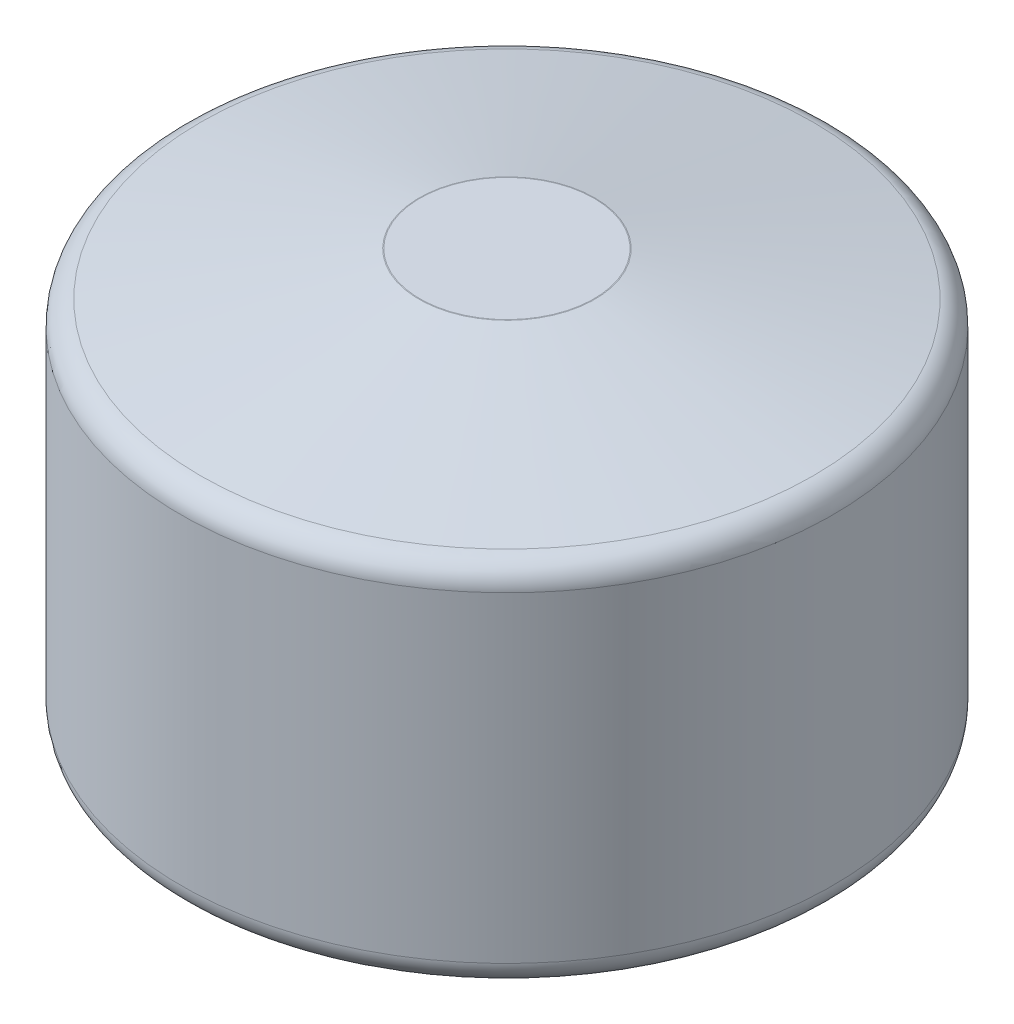
ISO-10303-21;
HEADER;
FILE_DESCRIPTION(('STEP AP214'),'2;1');
FILE_NAME('part.step','',(''),(''),'','','');
FILE_SCHEMA(('AUTOMOTIVE_DESIGN { 1 0 10303 214 1 1 1 1 }'));
ENDSEC;
DATA;
#1=APPLICATION_CONTEXT('core data for automotive mechanical design processes');
#2=APPLICATION_PROTOCOL_DEFINITION('international standard','automotive_design',2000,#1);
#3=PRODUCT_CONTEXT('',#1,'mechanical');
#4=PRODUCT('Part','Part','',(#3));
#5=PRODUCT_RELATED_PRODUCT_CATEGORY('part','',(#4));
#6=PRODUCT_DEFINITION_FORMATION('','',#4);
#7=PRODUCT_DEFINITION_CONTEXT('part definition',#1,'design');
#8=PRODUCT_DEFINITION('design','',#6,#7);
#9=PRODUCT_DEFINITION_SHAPE('','',#8);
#10=(LENGTH_UNIT() NAMED_UNIT(*) SI_UNIT(.MILLI.,.METRE.));
#11=(NAMED_UNIT(*) PLANE_ANGLE_UNIT() SI_UNIT($,.RADIAN.));
#12=(NAMED_UNIT(*) SI_UNIT($,.STERADIAN.) SOLID_ANGLE_UNIT());
#13=UNCERTAINTY_MEASURE_WITH_UNIT(LENGTH_MEASURE(1.E-05),#10,'distance_accuracy_value','');
#14=(GEOMETRIC_REPRESENTATION_CONTEXT(3) GLOBAL_UNCERTAINTY_ASSIGNED_CONTEXT((#13)) GLOBAL_UNIT_ASSIGNED_CONTEXT((#10,
#11,#12)) REPRESENTATION_CONTEXT('',''));
#15=CARTESIAN_POINT('',(0.,0.,0.));
#16=DIRECTION('',(0.,0.,1.));
#17=DIRECTION('',(1.,0.,0.));
#18=AXIS2_PLACEMENT_3D('',#15,#16,#17);
#19=CARTESIAN_POINT('',(0.,3.96500172794021,0.));
#20=DIRECTION('',(0.,-1.,0.));
#21=DIRECTION('',(0.,0.,-1.));
#22=AXIS2_PLACEMENT_3D('',#19,#20,#21);
#23=TOROIDAL_SURFACE('',#22,3.7,0.3);
#24=CARTESIAN_POINT('',(0.,4.2591861255042,0.));
#25=DIRECTION('',(0.,-1.,0.));
#26=DIRECTION('',(0.,0.,-1.));
#27=AXIS2_PLACEMENT_3D('',#24,#25,#26);
#28=CIRCLE('',#27,3.75878384327275);
#29=CARTESIAN_POINT('',(0.,4.2591861255042,-3.75878384327275));
#30=VERTEX_POINT('',#29);
#31=EDGE_CURVE('E108',#30,#30,#28,.T.);
#32=ORIENTED_EDGE('',*,*,#31,.T.);
#33=EDGE_LOOP('',(#32));
#34=FACE_BOUND('',#33,.T.);
#35=CARTESIAN_POINT('',(0.,3.96500172794021,0.));
#36=DIRECTION('',(0.,-1.,0.));
#37=DIRECTION('',(0.,0.,-1.));
#38=AXIS2_PLACEMENT_3D('',#35,#36,#37);
#39=CIRCLE('',#38,4.);
#40=CARTESIAN_POINT('',(0.,3.96500172794021,-4.));
#41=VERTEX_POINT('',#40);
#42=EDGE_CURVE('E10',#41,#41,#39,.T.);
#43=ORIENTED_EDGE('',*,*,#42,.F.);
#44=EDGE_LOOP('',(#43));
#45=FACE_BOUND('',#44,.T.);
#46=ADVANCED_FACE('F41',(#34,#45),#23,.T.);
#47=CARTESIAN_POINT('',(0.,0.,0.));
#48=DIRECTION('',(0.,-1.,0.));
#49=DIRECTION('',(0.,0.,-1.));
#50=AXIS2_PLACEMENT_3D('',#47,#48,#49);
#51=CYLINDRICAL_SURFACE('',#50,4.);
#52=ORIENTED_EDGE('',*,*,#42,.T.);
#53=EDGE_LOOP('',(#52));
#54=FACE_BOUND('',#53,.T.);
#55=CARTESIAN_POINT('',(0.,0.0259275752775616,0.));
#56=DIRECTION('',(0.,-1.,0.));
#57=DIRECTION('',(0.,0.,-1.));
#58=AXIS2_PLACEMENT_3D('',#55,#56,#57);
#59=CIRCLE('',#58,4.);
#60=CARTESIAN_POINT('',(0.,0.0259275752775616,-4.));
#61=VERTEX_POINT('',#60);
#62=EDGE_CURVE('E48',#61,#61,#59,.T.);
#63=ORIENTED_EDGE('',*,*,#62,.F.);
#64=EDGE_LOOP('',(#63));
#65=FACE_BOUND('',#64,.T.);
#66=ADVANCED_FACE('F127',(#54,#65),#51,.T.);
#67=CARTESIAN_POINT('',(0.,0.0259275752775599,0.));
#68=DIRECTION('',(0.,-1.,0.));
#69=DIRECTION('',(0.,0.,-1.));
#70=AXIS2_PLACEMENT_3D('',#67,#68,#69);
#71=TOROIDAL_SURFACE('',#70,3.7,0.3);
#72=ORIENTED_EDGE('',*,*,#62,.T.);
#73=EDGE_LOOP('',(#72));
#74=FACE_BOUND('',#73,.T.);
#75=CARTESIAN_POINT('',(0.,-0.263850172609161,0.));
#76=DIRECTION('',(0.,-1.,0.));
#77=DIRECTION('',(0.,0.,-1.));
#78=AXIS2_PLACEMENT_3D('',#75,#76,#77);
#79=CIRCLE('',#78,3.77764571353075);
#80=CARTESIAN_POINT('',(0.,-0.263850172609161,-3.77764571353075));
#81=VERTEX_POINT('',#80);
#82=EDGE_CURVE('E53',#81,#81,#79,.T.);
#83=ORIENTED_EDGE('',*,*,#82,.F.);
#84=EDGE_LOOP('',(#83));
#85=FACE_BOUND('',#84,.T.);
#86=ADVANCED_FACE('F131',(#74,#85),#71,.T.);
#87=CARTESIAN_POINT('',(0.,-0.49554711508431,0.));
#88=DIRECTION('',(0.,1.,0.));
#89=DIRECTION('',(0.,0.,1.));
#90=AXIS2_PLACEMENT_3D('',#87,#88,#89);
#91=CONICAL_SURFACE('',#90,2.91294095225513,1.30899693899575);
#92=ORIENTED_EDGE('',*,*,#82,.T.);
#93=EDGE_LOOP('',(#92));
#94=FACE_BOUND('',#93,.T.);
#95=CARTESIAN_POINT('',(0.,-0.49554711508431,0.));
#96=DIRECTION('',(0.,-1.,0.));
#97=DIRECTION('',(0.,0.,-1.));
#98=AXIS2_PLACEMENT_3D('',#95,#96,#97);
#99=CIRCLE('',#98,2.91294095225513);
#100=CARTESIAN_POINT('',(0.,-0.49554711508431,-2.91294095225513));
#101=VERTEX_POINT('',#100);
#102=EDGE_CURVE('E58',#101,#101,#99,.T.);
#103=ORIENTED_EDGE('',*,*,#102,.F.);
#104=EDGE_LOOP('',(#103));
#105=FACE_BOUND('',#104,.T.);
#106=ADVANCED_FACE('F135',(#94,#105),#91,.T.);
#107=CARTESIAN_POINT('',(0.,-0.447250823769856,0.));
#108=DIRECTION('',(0.,-1.,0.));
#109=DIRECTION('',(0.,0.,-1.));
#110=AXIS2_PLACEMENT_3D('',#107,#108,#109);
#111=TOROIDAL_SURFACE('',#110,2.9,0.0500000000000001);
#112=ORIENTED_EDGE('',*,*,#102,.T.);
#113=EDGE_LOOP('',(#112));
#114=FACE_BOUND('',#113,.T.);
#115=CARTESIAN_POINT('',(0.,-0.447250823769856,0.));
#116=DIRECTION('',(0.,-1.,0.));
#117=DIRECTION('',(0.,0.,-1.));
#118=AXIS2_PLACEMENT_3D('',#115,#116,#117);
#119=CIRCLE('',#118,2.85);
#120=CARTESIAN_POINT('',(0.,-0.447250823769856,-2.85));
#121=VERTEX_POINT('',#120);
#122=EDGE_CURVE('E64',#121,#121,#119,.T.);
#123=ORIENTED_EDGE('',*,*,#122,.F.);
#124=EDGE_LOOP('',(#123));
#125=FACE_BOUND('',#124,.T.);
#126=ADVANCED_FACE('F141',(#114,#125),#111,.T.);
#127=CARTESIAN_POINT('',(0.,0.,0.));
#128=DIRECTION('',(0.,-1.,0.));
#129=DIRECTION('',(0.,0.,-1.));
#130=AXIS2_PLACEMENT_3D('',#127,#128,#129);
#131=CYLINDRICAL_SURFACE('',#130,2.85);
#132=ORIENTED_EDGE('',*,*,#122,.T.);
#133=EDGE_LOOP('',(#132));
#134=FACE_BOUND('',#133,.T.);
#135=CARTESIAN_POINT('',(0.,-0.263872446113781,0.));
#136=DIRECTION('',(0.,-1.,0.));
#137=DIRECTION('',(0.,0.,-1.));
#138=AXIS2_PLACEMENT_3D('',#135,#136,#137);
#139=CIRCLE('',#138,2.85);
#140=CARTESIAN_POINT('',(0.,-0.263872446113781,-2.85));
#141=VERTEX_POINT('',#140);
#142=EDGE_CURVE('E68',#141,#141,#139,.T.);
#143=ORIENTED_EDGE('',*,*,#142,.F.);
#144=EDGE_LOOP('',(#143));
#145=FACE_BOUND('',#144,.T.);
#146=ADVANCED_FACE('F145',(#134,#145),#131,.F.);
#147=CARTESIAN_POINT('',(0.,-0.263872446113781,0.));
#148=DIRECTION('',(0.,-1.,0.));
#149=DIRECTION('',(0.,0.,-1.));
#150=AXIS2_PLACEMENT_3D('',#147,#148,#149);
#151=TOROIDAL_SURFACE('',#150,2.9,0.0500000000000001);
#152=ORIENTED_EDGE('',*,*,#142,.T.);
#153=EDGE_LOOP('',(#152));
#154=FACE_BOUND('',#153,.T.);
#155=CARTESIAN_POINT('',(0.,-0.215576154799328,0.));
#156=DIRECTION('',(0.,-1.,0.));
#157=DIRECTION('',(0.,0.,-1.));
#158=AXIS2_PLACEMENT_3D('',#155,#156,#157);
#159=CIRCLE('',#158,2.88705904774487);
#160=CARTESIAN_POINT('',(0.,-0.215576154799328,-2.88705904774487));
#161=VERTEX_POINT('',#160);
#162=EDGE_CURVE('E72',#161,#161,#159,.T.);
#163=ORIENTED_EDGE('',*,*,#162,.F.);
#164=EDGE_LOOP('',(#163));
#165=FACE_BOUND('',#164,.T.);
#166=ADVANCED_FACE('F149',(#154,#165),#151,.T.);
#167=CARTESIAN_POINT('',(0.,-0.0650895598707248,0.));
#168=DIRECTION('',(0.,1.,0.));
#169=DIRECTION('',(0.,0.,1.));
#170=AXIS2_PLACEMENT_3D('',#167,#168,#169);
#171=CONICAL_SURFACE('',#170,3.44868266587646,1.30899693899575);
#172=ORIENTED_EDGE('',*,*,#162,.T.);
#173=EDGE_LOOP('',(#172));
#174=FACE_BOUND('',#173,.T.);
#175=CARTESIAN_POINT('',(0.,-0.0650895598707248,0.));
#176=DIRECTION('',(0.,-1.,0.));
#177=DIRECTION('',(0.,0.,-1.));
#178=AXIS2_PLACEMENT_3D('',#175,#176,#177);
#179=CIRCLE('',#178,3.44868266587646);
#180=CARTESIAN_POINT('',(0.,-0.0650895598707248,-3.44868266587646));
#181=VERTEX_POINT('',#180);
#182=EDGE_CURVE('E76',#181,#181,#179,.T.);
#183=ORIENTED_EDGE('',*,*,#182,.F.);
#184=EDGE_LOOP('',(#183));
#185=FACE_BOUND('',#184,.T.);
#186=ADVANCED_FACE('F153',(#174,#185),#171,.F.);
#187=CARTESIAN_POINT('',(0.,0.224688188015996,0.));
#188=DIRECTION('',(0.,-1.,0.));
#189=DIRECTION('',(0.,0.,-1.));
#190=AXIS2_PLACEMENT_3D('',#187,#188,#189);
#191=TOROIDAL_SURFACE('',#190,3.37103695234571,0.3);
#192=ORIENTED_EDGE('',*,*,#182,.T.);
#193=EDGE_LOOP('',(#192));
#194=FACE_BOUND('',#193,.T.);
#195=CARTESIAN_POINT('',(0.,0.224688188015998,0.));
#196=DIRECTION('',(0.,-1.,0.));
#197=DIRECTION('',(0.,0.,-1.));
#198=AXIS2_PLACEMENT_3D('',#195,#196,#197);
#199=CIRCLE('',#198,3.67103695234571);
#200=CARTESIAN_POINT('',(0.,0.224688188015998,-3.67103695234571));
#201=VERTEX_POINT('',#200);
#202=EDGE_CURVE('E80',#201,#201,#199,.T.);
#203=ORIENTED_EDGE('',*,*,#202,.F.);
#204=EDGE_LOOP('',(#203));
#205=FACE_BOUND('',#204,.T.);
#206=ADVANCED_FACE('F157',(#194,#205),#191,.F.);
#207=CARTESIAN_POINT('',(0.,0.,0.));
#208=DIRECTION('',(0.,-1.,0.));
#209=DIRECTION('',(0.,0.,-1.));
#210=AXIS2_PLACEMENT_3D('',#207,#208,#209);
#211=CYLINDRICAL_SURFACE('',#210,3.67103695234571);
#212=ORIENTED_EDGE('',*,*,#202,.T.);
#213=EDGE_LOOP('',(#212));
#214=FACE_BOUND('',#213,.T.);
#215=CARTESIAN_POINT('',(0.,2.44974482566162,0.));
#216=DIRECTION('',(0.,-1.,0.));
#217=DIRECTION('',(0.,0.,-1.));
#218=AXIS2_PLACEMENT_3D('',#215,#216,#217);
#219=CIRCLE('',#218,3.67103695234571);
#220=CARTESIAN_POINT('',(0.,2.44974482566162,-3.67103695234571));
#221=VERTEX_POINT('',#220);
#222=EDGE_CURVE('E84',#221,#221,#219,.T.);
#223=ORIENTED_EDGE('',*,*,#222,.F.);
#224=EDGE_LOOP('',(#223));
#225=FACE_BOUND('',#224,.T.);
#226=ADVANCED_FACE('F161',(#214,#225),#211,.F.);
#227=CARTESIAN_POINT('',(0.,2.44974482566162,0.));
#228=DIRECTION('',(0.,-1.,0.));
#229=DIRECTION('',(0.,0.,-1.));
#230=AXIS2_PLACEMENT_3D('',#227,#228,#229);
#231=TOROIDAL_SURFACE('',#230,3.37103695234571,0.3);
#232=ORIENTED_EDGE('',*,*,#222,.T.);
#233=EDGE_LOOP('',(#232));
#234=FACE_BOUND('',#233,.T.);
#235=CARTESIAN_POINT('',(0.,2.7439292232256,0.));
#236=DIRECTION('',(0.,-1.,0.));
#237=DIRECTION('',(0.,0.,-1.));
#238=AXIS2_PLACEMENT_3D('',#235,#236,#237);
#239=CIRCLE('',#238,3.42982079561846);
#240=CARTESIAN_POINT('',(0.,2.7439292232256,-3.42982079561846));
#241=VERTEX_POINT('',#240);
#242=EDGE_CURVE('E88',#241,#241,#239,.T.);
#243=ORIENTED_EDGE('',*,*,#242,.F.);
#244=EDGE_LOOP('',(#243));
#245=FACE_BOUND('',#244,.T.);
#246=ADVANCED_FACE('F165',(#234,#245),#231,.F.);
#247=CARTESIAN_POINT('',(0.,2.91695020196124,0.));
#248=DIRECTION('',(0.,-1.,0.));
#249=DIRECTION('',(0.,0.,-1.));
#250=AXIS2_PLACEMENT_3D('',#247,#248,#249);
#251=CONICAL_SURFACE('',#250,2.56393538286821,1.37357412131954);
#252=ORIENTED_EDGE('',*,*,#242,.T.);
#253=EDGE_LOOP('',(#252));
#254=FACE_BOUND('',#253,.T.);
#255=CARTESIAN_POINT('',(0.,2.91695020196124,0.));
#256=DIRECTION('',(0.,-1.,0.));
#257=DIRECTION('',(0.,0.,-1.));
#258=AXIS2_PLACEMENT_3D('',#255,#256,#257);
#259=CIRCLE('',#258,2.56393538286821);
#260=CARTESIAN_POINT('',(0.,2.91695020196124,-2.56393538286821));
#261=VERTEX_POINT('',#260);
#262=EDGE_CURVE('E92',#261,#261,#259,.T.);
#263=ORIENTED_EDGE('',*,*,#262,.F.);
#264=EDGE_LOOP('',(#263));
#265=FACE_BOUND('',#264,.T.);
#266=ADVANCED_FACE('F169',(#254,#265),#251,.F.);
#267=CARTESIAN_POINT('',(0.,2.86791946903391,0.));
#268=DIRECTION('',(0.,-1.,0.));
#269=DIRECTION('',(0.,0.,-1.));
#270=AXIS2_PLACEMENT_3D('',#267,#268,#269);
#271=TOROIDAL_SURFACE('',#270,2.55413807565608,0.0500000000000001);
#272=ORIENTED_EDGE('',*,*,#262,.T.);
#273=EDGE_LOOP('',(#272));
#274=FACE_BOUND('',#273,.T.);
#275=CARTESIAN_POINT('',(0.,2.91791946903391,0.));
#276=DIRECTION('',(0.,-1.,0.));
#277=DIRECTION('',(0.,0.,-1.));
#278=AXIS2_PLACEMENT_3D('',#275,#276,#277);
#279=CIRCLE('',#278,2.55413807565608);
#280=CARTESIAN_POINT('',(0.,2.91791946903391,-2.55413807565608));
#281=VERTEX_POINT('',#280);
#282=EDGE_CURVE('E96',#281,#281,#279,.T.);
#283=ORIENTED_EDGE('',*,*,#282,.F.);
#284=EDGE_LOOP('',(#283));
#285=FACE_BOUND('',#284,.T.);
#286=ADVANCED_FACE('F173',(#274,#285),#271,.F.);
#287=CARTESIAN_POINT('',(0.,2.91791946903391,-2.55413807565608));
#288=DIRECTION('',(0.,-1.,0.));
#289=DIRECTION('',(0.,0.,-1.));
#290=AXIS2_PLACEMENT_3D('',#287,#288,#289);
#291=PLANE('',#290);
#292=ORIENTED_EDGE('',*,*,#282,.T.);
#293=EDGE_LOOP('',(#292));
#294=FACE_BOUND('',#293,.T.);
#295=ADVANCED_FACE('F177',(#294),#291,.T.);
#296=CARTESIAN_POINT('',(0.,4.79572947888387,-1.06870006346563));
#297=DIRECTION('',(0.,1.,0.));
#298=DIRECTION('',(0.,0.,1.));
#299=AXIS2_PLACEMENT_3D('',#296,#297,#298);
#300=PLANE('',#299);
#301=CARTESIAN_POINT('',(0.,4.79572947888387,0.));
#302=DIRECTION('',(0.,-1.,0.));
#303=DIRECTION('',(0.,0.,-1.));
#304=AXIS2_PLACEMENT_3D('',#301,#302,#303);
#305=CIRCLE('',#304,1.06870006346563);
#306=CARTESIAN_POINT('',(0.,4.79572947888387,-1.06870006346563));
#307=VERTEX_POINT('',#306);
#308=EDGE_CURVE('E100',#307,#307,#305,.T.);
#309=ORIENTED_EDGE('',*,*,#308,.F.);
#310=EDGE_LOOP('',(#309));
#311=FACE_BOUND('',#310,.T.);
#312=ADVANCED_FACE('F123',(#311),#300,.T.);
#313=CARTESIAN_POINT('',(0.,4.74572947888387,0.));
#314=DIRECTION('',(0.,-1.,0.));
#315=DIRECTION('',(0.,0.,-1.));
#316=AXIS2_PLACEMENT_3D('',#313,#314,#315);
#317=TOROIDAL_SURFACE('',#316,1.06870006346563,0.0499999999999996);
#318=ORIENTED_EDGE('',*,*,#308,.T.);
#319=EDGE_LOOP('',(#318));
#320=FACE_BOUND('',#319,.T.);
#321=CARTESIAN_POINT('',(0.,4.7947602118112,0.));
#322=DIRECTION('',(0.,-1.,0.));
#323=DIRECTION('',(0.,0.,-1.));
#324=AXIS2_PLACEMENT_3D('',#321,#322,#323);
#325=CIRCLE('',#324,1.07849737067776);
#326=CARTESIAN_POINT('',(0.,4.7947602118112,-1.07849737067775));
#327=VERTEX_POINT('',#326);
#328=EDGE_CURVE('E104',#327,#327,#325,.T.);
#329=ORIENTED_EDGE('',*,*,#328,.F.);
#330=EDGE_LOOP('',(#329));
#331=FACE_BOUND('',#330,.T.);
#332=ADVANCED_FACE('F117',(#320,#331),#317,.T.);
#333=CARTESIAN_POINT('',(0.,4.2591861255042,0.));
#334=DIRECTION('',(0.,-1.,0.));
#335=DIRECTION('',(0.,0.,-1.));
#336=AXIS2_PLACEMENT_3D('',#333,#334,#335);
#337=CONICAL_SURFACE('',#336,3.75878384327275,1.37357412131954);
#338=CARTESIAN_POINT('',(0.,4.7947602118112,-1.07849737067775));
#339=CARTESIAN_POINT('',(0.,4.78918131507884,-1.10641702143395));
#340=CARTESIAN_POINT('',(0.,4.78360241834647,-1.13433667219015));
#341=CARTESIAN_POINT('',(0.,4.77244462488174,-1.19017597370254));
#342=CARTESIAN_POINT('',(0.,4.76686572814938,-1.21809562445874));
#343=CARTESIAN_POINT('',(0.,4.75570793468465,-1.27393492597113));
#344=CARTESIAN_POINT('',(0.,4.75012903795229,-1.30185457672733));
#345=CARTESIAN_POINT('',(0.,4.73897124448756,-1.35769387823973));
#346=CARTESIAN_POINT('',(0.,4.73339234775519,-1.38561352899593));
#347=CARTESIAN_POINT('',(0.,4.72223455429046,-1.44145283050832));
#348=CARTESIAN_POINT('',(0.,4.7166556575581,-1.46937248126452));
#349=CARTESIAN_POINT('',(0.,4.70549786409337,-1.52521178277692));
#350=CARTESIAN_POINT('',(0.,4.699918967361,-1.55313143353311));
#351=CARTESIAN_POINT('',(0.,4.68876117389627,-1.60897073504551));
#352=CARTESIAN_POINT('',(0.,4.68318227716391,-1.63689038580171));
#353=CARTESIAN_POINT('',(0.,4.67202448369918,-1.6927296873141));
#354=CARTESIAN_POINT('',(0.,4.66644558696682,-1.7206493380703));
#355=CARTESIAN_POINT('',(0.,4.65528779350209,-1.7764886395827));
#356=CARTESIAN_POINT('',(0.,4.64970889676972,-1.8044082903389));
#357=CARTESIAN_POINT('',(0.,4.63855110330499,-1.86024759185129));
#358=CARTESIAN_POINT('',(0.,4.63297220657263,-1.88816724260749));
#359=CARTESIAN_POINT('',(0.,4.6218144131079,-1.94400654411989));
#360=CARTESIAN_POINT('',(0.,4.61623551637553,-1.97192619487608));
#361=CARTESIAN_POINT('',(0.,4.6050777229108,-2.02776549638848));
#362=CARTESIAN_POINT('',(0.,4.59949882617844,-2.05568514714468));
#363=CARTESIAN_POINT('',(0.,4.58834103271371,-2.11152444865707));
#364=CARTESIAN_POINT('',(0.,4.58276213598135,-2.13944409941327));
#365=CARTESIAN_POINT('',(0.,4.57160434251662,-2.19528340092567));
#366=CARTESIAN_POINT('',(0.,4.56602544578425,-2.22320305168186));
#367=CARTESIAN_POINT('',(0.,4.55486765231952,-2.27904235319426));
#368=CARTESIAN_POINT('',(0.,4.54928875558716,-2.30696200395046));
#369=CARTESIAN_POINT('',(0.,4.53813096212243,-2.36280130546285));
#370=CARTESIAN_POINT('',(0.,4.53255206539006,-2.39072095621905));
#371=CARTESIAN_POINT('',(0.,4.52139427192534,-2.44656025773145));
#372=CARTESIAN_POINT('',(0.,4.51581537519297,-2.47447990848765));
#373=CARTESIAN_POINT('',(0.,4.50465758172824,-2.53031921000004));
#374=CARTESIAN_POINT('',(0.,4.49907868499588,-2.55823886075624));
#375=CARTESIAN_POINT('',(0.,4.48792089153115,-2.61407816226864));
#376=CARTESIAN_POINT('',(0.,4.48234199479878,-2.64199781302483));
#377=CARTESIAN_POINT('',(0.,4.47118420133405,-2.69783711453723));
#378=CARTESIAN_POINT('',(0.,4.46560530460169,-2.72575676529343));
#379=CARTESIAN_POINT('',(0.,4.45444751113696,-2.78159606680582));
#380=CARTESIAN_POINT('',(0.,4.44886861440459,-2.80951571756202));
#381=CARTESIAN_POINT('',(0.,4.43771082093987,-2.86535501907442));
#382=CARTESIAN_POINT('',(0.,4.4321319242075,-2.89327466983061));
#383=CARTESIAN_POINT('',(0.,4.42097413074277,-2.94911397134301));
#384=CARTESIAN_POINT('',(0.,4.41539523401041,-2.97703362209921));
#385=CARTESIAN_POINT('',(0.,4.40423744054568,-3.0328729236116));
#386=CARTESIAN_POINT('',(0.,4.39865854381331,-3.0607925743678));
#387=CARTESIAN_POINT('',(0.,4.38750075034858,-3.1166318758802));
#388=CARTESIAN_POINT('',(0.,4.38192185361622,-3.1445515266364));
#389=CARTESIAN_POINT('',(0.,4.37076406015149,-3.20039082814879));
#390=CARTESIAN_POINT('',(0.,4.36518516341912,-3.22831047890499));
#391=CARTESIAN_POINT('',(0.,4.3540273699544,-3.28414978041739));
#392=CARTESIAN_POINT('',(0.,4.34844847322203,-3.31206943117358));
#393=CARTESIAN_POINT('',(0.,4.3372906797573,-3.36790873268598));
#394=CARTESIAN_POINT('',(0.,4.33171178302494,-3.39582838344218));
#395=CARTESIAN_POINT('',(0.,4.32055398956021,-3.45166768495457));
#396=CARTESIAN_POINT('',(0.,4.31497509282784,-3.47958733571077));
#397=CARTESIAN_POINT('',(0.,4.30381729936311,-3.53542663722317));
#398=CARTESIAN_POINT('',(0.,4.29823840263075,-3.56334628797937));
#399=CARTESIAN_POINT('',(0.,4.28708060916602,-3.61918558949176));
#400=CARTESIAN_POINT('',(0.,4.28150171243366,-3.64710524024796));
#401=CARTESIAN_POINT('',(0.,4.27034391896893,-3.70294454176035));
#402=CARTESIAN_POINT('',(0.,4.26476502223656,-3.73086419251655));
#403=CARTESIAN_POINT('',(0.,4.2591861255042,-3.75878384327275));
#404=B_SPLINE_CURVE_WITH_KNOTS('',3,(#338,#339,#340,#341,#342,#343,#344,#345,#346,#347,#348,
#349,#350,#351,#352,#353,#354,#355,#356,#357,#358,#359,#360,#361,#362,#363,#364,#365,#366,#367,
#368,#369,#370,#371,#372,#373,#374,#375,#376,#377,#378,#379,#380,#381,#382,#383,#384,#385,#386,
#387,#388,#389,#390,#391,#392,#393,#394,#395,#396,#397,#398,#399,#400,#401,#402,#403),
.UNSPECIFIED.,.F.,.F.,(4,2,2,2,2,2,2,2,2,2,2,2,2,2,2,2,2,2,2,2,2,2,2,2,2,2,2,2,2,2,2,2,4),(0.,
0.0854147462905912,0.170829492581182,0.256244238871774,0.341658985162365,0.427073731452956,
0.512488477743548,0.597903224034139,0.68331797032473,0.768732716615321,0.854147462905913,
0.939562209196504,1.02497695548709,1.11039170177769,1.19580644806828,1.28122119435887,
1.36663594064946,1.45205068694005,1.53746543323064,1.62288017952123,1.70829492581182,
1.79370967210242,1.87912441839301,1.9645391646836,2.04995391097419,2.13536865726478,
2.22078340355537,2.30619814984596,2.39161289613656,2.47702764242715,2.56244238871774,
2.64785713500833,2.73327188129892),.UNSPECIFIED.);
#405=EDGE_CURVE('BSEAM115',#327,#30,#404,.T.);
#406=ORIENTED_EDGE('',*,*,#328,.T.);
#407=ORIENTED_EDGE('',*,*,#31,.F.);
#408=ORIENTED_EDGE('',*,*,#405,.T.);
#409=ORIENTED_EDGE('',*,*,#405,.F.);
#410=EDGE_LOOP('',(#406,#408,#407,#409));
#411=FACE_BOUND('',#410,.T.);
#412=ADVANCED_FACE('F115',(#411),#337,.T.);
#413=CLOSED_SHELL('',(#46,#66,#86,#106,#126,#146,#166,#186,#206,#226,#246,#266,#286,#295,#312,
#332,#412));
#414=MANIFOLD_SOLID_BREP('B2',#413);
#415=ADVANCED_BREP_SHAPE_REPRESENTATION('',(#18,#414),#14);
#416=SHAPE_DEFINITION_REPRESENTATION(#9,#415);
ENDSEC;
END-ISO-10303-21;
